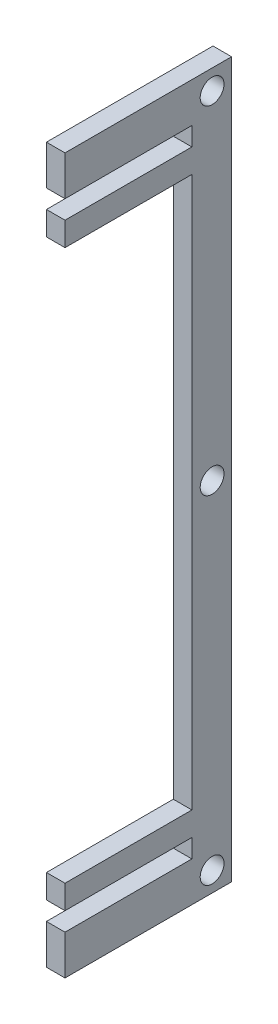
ISO-10303-21;
HEADER;
FILE_DESCRIPTION(('STEP AP214'),'2;1');
FILE_NAME('part.step','',(''),(''),'','','');
FILE_SCHEMA(('AUTOMOTIVE_DESIGN { 1 0 10303 214 1 1 1 1 }'));
ENDSEC;
DATA;
#1=APPLICATION_CONTEXT('core data for automotive mechanical design processes');
#2=APPLICATION_PROTOCOL_DEFINITION('international standard','automotive_design',2000,#1);
#3=PRODUCT_CONTEXT('',#1,'mechanical');
#4=PRODUCT('Part','Part','',(#3));
#5=PRODUCT_RELATED_PRODUCT_CATEGORY('part','',(#4));
#6=PRODUCT_DEFINITION_FORMATION('','',#4);
#7=PRODUCT_DEFINITION_CONTEXT('part definition',#1,'design');
#8=PRODUCT_DEFINITION('design','',#6,#7);
#9=PRODUCT_DEFINITION_SHAPE('','',#8);
#10=(LENGTH_UNIT() NAMED_UNIT(*) SI_UNIT(.MILLI.,.METRE.));
#11=(NAMED_UNIT(*) PLANE_ANGLE_UNIT() SI_UNIT($,.RADIAN.));
#12=(NAMED_UNIT(*) SI_UNIT($,.STERADIAN.) SOLID_ANGLE_UNIT());
#13=UNCERTAINTY_MEASURE_WITH_UNIT(LENGTH_MEASURE(1.E-05),#10,'distance_accuracy_value','');
#14=(GEOMETRIC_REPRESENTATION_CONTEXT(3) GLOBAL_UNCERTAINTY_ASSIGNED_CONTEXT((#13)) GLOBAL_UNIT_ASSIGNED_CONTEXT((#10,
#11,#12)) REPRESENTATION_CONTEXT('',''));
#15=CARTESIAN_POINT('',(0.,0.,0.));
#16=DIRECTION('',(0.,0.,1.));
#17=DIRECTION('',(1.,0.,0.));
#18=AXIS2_PLACEMENT_3D('',#15,#16,#17);
#19=CARTESIAN_POINT('',(2.9718,57.15,13.3216783216783));
#20=DIRECTION('',(0.,0.,-1.));
#21=DIRECTION('',(0.,1.,0.));
#22=AXIS2_PLACEMENT_3D('',#19,#20,#21);
#23=PLANE('',#22);
#24=DIRECTION('',(0.,-1.,0.));
#25=VECTOR('',#24,1.);
#26=CARTESIAN_POINT('',(2.9718,57.15,13.3216783216783));
#27=LINE('',#26,#25);
#28=CARTESIAN_POINT('',(2.9718,-50.8,13.3216783216783));
#29=VERTEX_POINT('',#28);
#30=CARTESIAN_POINT('',(2.9718,-57.15,13.3216783216783));
#31=VERTEX_POINT('',#30);
#32=EDGE_CURVE('E225',#29,#31,#27,.T.);
#33=ORIENTED_EDGE('',*,*,#32,.F.);
#34=DIRECTION('',(1.,0.,0.));
#35=VECTOR('',#34,1.);
#36=CARTESIAN_POINT('',(-0.2032,-50.8,13.3216783216783));
#37=LINE('',#36,#35);
#38=CARTESIAN_POINT('',(0.,-50.8,13.3216783216783));
#39=VERTEX_POINT('',#38);
#40=EDGE_CURVE('E169',#39,#29,#37,.T.);
#41=ORIENTED_EDGE('',*,*,#40,.F.);
#42=DIRECTION('',(0.,-1.,0.));
#43=VECTOR('',#42,1.);
#44=CARTESIAN_POINT('',(0.,57.15,13.3216783216783));
#45=LINE('',#44,#43);
#46=CARTESIAN_POINT('',(0.,-57.15,13.3216783216783));
#47=VERTEX_POINT('',#46);
#48=EDGE_CURVE('E237',#39,#47,#45,.T.);
#49=ORIENTED_EDGE('',*,*,#48,.T.);
#50=DIRECTION('',(-1.,0.,0.));
#51=VECTOR('',#50,1.);
#52=CARTESIAN_POINT('',(2.9718,-57.15,13.3216783216783));
#53=LINE('',#52,#51);
#54=EDGE_CURVE('E229',#31,#47,#53,.T.);
#55=ORIENTED_EDGE('',*,*,#54,.F.);
#56=EDGE_LOOP('',(#33,#41,#49,#55));
#57=FACE_BOUND('',#56,.T.);
#58=ADVANCED_FACE('F41',(#57),#23,.F.);
#59=CARTESIAN_POINT('',(0.,57.15,13.3216783216783));
#60=VERTEX_POINT('',#59);
#61=CARTESIAN_POINT('',(0.,50.8,13.3216783216783));
#62=VERTEX_POINT('',#61);
#63=EDGE_CURVE('E221',#60,#62,#45,.T.);
#64=ORIENTED_EDGE('',*,*,#63,.T.);
#65=DIRECTION('',(1.,0.,0.));
#66=VECTOR('',#65,1.);
#67=CARTESIAN_POINT('',(-0.2032,50.8,13.3216783216783));
#68=LINE('',#67,#66);
#69=CARTESIAN_POINT('',(2.9718,50.8,13.3216783216783));
#70=VERTEX_POINT('',#69);
#71=EDGE_CURVE('E186',#62,#70,#68,.T.);
#72=ORIENTED_EDGE('',*,*,#71,.T.);
#73=CARTESIAN_POINT('',(2.9718,57.15,13.3216783216783));
#74=VERTEX_POINT('',#73);
#75=EDGE_CURVE('E226',#74,#70,#27,.T.);
#76=ORIENTED_EDGE('',*,*,#75,.F.);
#77=DIRECTION('',(-1.,0.,0.));
#78=VECTOR('',#77,1.);
#79=CARTESIAN_POINT('',(2.9718,57.15,13.3216783216783));
#80=LINE('',#79,#78);
#81=EDGE_CURVE('E243',#74,#60,#80,.T.);
#82=ORIENTED_EDGE('',*,*,#81,.T.);
#83=EDGE_LOOP('',(#64,#72,#76,#82));
#84=FACE_BOUND('',#83,.T.);
#85=ADVANCED_FACE('F299',(#84),#23,.F.);
#86=CARTESIAN_POINT('',(0.,-44.0182,13.3216783216783));
#87=VERTEX_POINT('',#86);
#88=CARTESIAN_POINT('',(0.,-47.8282,13.3216783216783));
#89=VERTEX_POINT('',#88);
#90=EDGE_CURVE('E332',#87,#89,#45,.T.);
#91=ORIENTED_EDGE('',*,*,#90,.T.);
#92=DIRECTION('',(1.,0.,0.));
#93=VECTOR('',#92,1.);
#94=CARTESIAN_POINT('',(-0.2032,-47.8282,13.3216783216783));
#95=LINE('',#94,#93);
#96=CARTESIAN_POINT('',(2.9718,-47.8282,13.3216783216783));
#97=VERTEX_POINT('',#96);
#98=EDGE_CURVE('E182',#89,#97,#95,.T.);
#99=ORIENTED_EDGE('',*,*,#98,.T.);
#100=CARTESIAN_POINT('',(2.9718,-44.0182,13.3216783216783));
#101=VERTEX_POINT('',#100);
#102=EDGE_CURVE('E346',#101,#97,#27,.T.);
#103=ORIENTED_EDGE('',*,*,#102,.F.);
#104=DIRECTION('',(1.,0.,0.));
#105=VECTOR('',#104,1.);
#106=CARTESIAN_POINT('',(-0.2032,-44.0182,13.3216783216783));
#107=LINE('',#106,#105);
#108=EDGE_CURVE('E209',#87,#101,#107,.T.);
#109=ORIENTED_EDGE('',*,*,#108,.F.);
#110=EDGE_LOOP('',(#91,#99,#103,#109));
#111=FACE_BOUND('',#110,.T.);
#112=ADVANCED_FACE('F307',(#111),#23,.F.);
#113=CARTESIAN_POINT('',(2.9718,-57.15,-13.3216783216783));
#114=DIRECTION('',(0.,1.,0.));
#115=DIRECTION('',(0.,0.,1.));
#116=AXIS2_PLACEMENT_3D('',#113,#114,#115);
#117=PLANE('',#116);
#118=DIRECTION('',(0.,0.,-1.));
#119=VECTOR('',#118,1.);
#120=CARTESIAN_POINT('',(0.,-57.15,-13.3216783216783));
#121=LINE('',#120,#119);
#122=CARTESIAN_POINT('',(0.,-57.15,-13.3216783216783));
#123=VERTEX_POINT('',#122);
#124=EDGE_CURVE('E181',#47,#123,#121,.T.);
#125=ORIENTED_EDGE('',*,*,#124,.T.);
#126=DIRECTION('',(-1.,0.,0.));
#127=VECTOR('',#126,1.);
#128=CARTESIAN_POINT('',(2.9718,-57.15,-13.3216783216783));
#129=LINE('',#128,#127);
#130=CARTESIAN_POINT('',(2.9718,-57.15,-13.3216783216783));
#131=VERTEX_POINT('',#130);
#132=EDGE_CURVE('E249',#131,#123,#129,.T.);
#133=ORIENTED_EDGE('',*,*,#132,.F.);
#134=DIRECTION('',(0.,0.,-1.));
#135=VECTOR('',#134,1.);
#136=CARTESIAN_POINT('',(2.9718,-57.15,-13.3216783216783));
#137=LINE('',#136,#135);
#138=EDGE_CURVE('E217',#31,#131,#137,.T.);
#139=ORIENTED_EDGE('',*,*,#138,.F.);
#140=ORIENTED_EDGE('',*,*,#54,.T.);
#141=EDGE_LOOP('',(#125,#133,#139,#140));
#142=FACE_BOUND('',#141,.T.);
#143=ADVANCED_FACE('F43',(#142),#117,.F.);
#144=CARTESIAN_POINT('',(2.9718,57.15,-13.3216783216783));
#145=DIRECTION('',(0.,0.,1.));
#146=DIRECTION('',(0.,-1.,0.));
#147=AXIS2_PLACEMENT_3D('',#144,#145,#146);
#148=PLANE('',#147);
#149=DIRECTION('',(0.,1.,0.));
#150=VECTOR('',#149,1.);
#151=CARTESIAN_POINT('',(0.,57.15,-13.3216783216783));
#152=LINE('',#151,#150);
#153=CARTESIAN_POINT('',(0.,57.15,-13.3216783216783));
#154=VERTEX_POINT('',#153);
#155=EDGE_CURVE('E233',#123,#154,#152,.T.);
#156=ORIENTED_EDGE('',*,*,#155,.T.);
#157=DIRECTION('',(-1.,0.,0.));
#158=VECTOR('',#157,1.);
#159=CARTESIAN_POINT('',(2.9718,57.15,-13.3216783216783));
#160=LINE('',#159,#158);
#161=CARTESIAN_POINT('',(2.9718,57.15,-13.3216783216783));
#162=VERTEX_POINT('',#161);
#163=EDGE_CURVE('E246',#162,#154,#160,.T.);
#164=ORIENTED_EDGE('',*,*,#163,.F.);
#165=DIRECTION('',(0.,1.,0.));
#166=VECTOR('',#165,1.);
#167=CARTESIAN_POINT('',(2.9718,57.15,-13.3216783216783));
#168=LINE('',#167,#166);
#169=EDGE_CURVE('E220',#131,#162,#168,.T.);
#170=ORIENTED_EDGE('',*,*,#169,.F.);
#171=ORIENTED_EDGE('',*,*,#132,.T.);
#172=EDGE_LOOP('',(#156,#164,#170,#171));
#173=FACE_BOUND('',#172,.T.);
#174=ADVANCED_FACE('F321',(#173),#148,.F.);
#175=CARTESIAN_POINT('',(2.9718,57.15,-13.3216783216783));
#176=DIRECTION('',(0.,-1.,0.));
#177=DIRECTION('',(0.,0.,-1.));
#178=AXIS2_PLACEMENT_3D('',#175,#176,#177);
#179=PLANE('',#178);
#180=DIRECTION('',(0.,0.,1.));
#181=VECTOR('',#180,1.);
#182=CARTESIAN_POINT('',(0.,57.15,-13.3216783216783));
#183=LINE('',#182,#181);
#184=EDGE_CURVE('E235',#154,#60,#183,.T.);
#185=ORIENTED_EDGE('',*,*,#184,.T.);
#186=ORIENTED_EDGE('',*,*,#81,.F.);
#187=DIRECTION('',(0.,0.,1.));
#188=VECTOR('',#187,1.);
#189=CARTESIAN_POINT('',(2.9718,57.15,-13.3216783216783));
#190=LINE('',#189,#188);
#191=EDGE_CURVE('E223',#162,#74,#190,.T.);
#192=ORIENTED_EDGE('',*,*,#191,.F.);
#193=ORIENTED_EDGE('',*,*,#163,.T.);
#194=EDGE_LOOP('',(#185,#186,#192,#193));
#195=FACE_BOUND('',#194,.T.);
#196=ADVANCED_FACE('F312',(#195),#179,.F.);
#197=CARTESIAN_POINT('',(2.9718,47.8282,13.3216783216783));
#198=VERTEX_POINT('',#197);
#199=CARTESIAN_POINT('',(2.9718,44.0182,13.3216783216783));
#200=VERTEX_POINT('',#199);
#201=EDGE_CURVE('E230',#198,#200,#27,.T.);
#202=ORIENTED_EDGE('',*,*,#201,.F.);
#203=DIRECTION('',(1.,0.,0.));
#204=VECTOR('',#203,1.);
#205=CARTESIAN_POINT('',(-0.2032,47.8282,13.3216783216783));
#206=LINE('',#205,#204);
#207=CARTESIAN_POINT('',(0.,47.8282,13.3216783216783));
#208=VERTEX_POINT('',#207);
#209=EDGE_CURVE('E190',#208,#198,#206,.T.);
#210=ORIENTED_EDGE('',*,*,#209,.F.);
#211=CARTESIAN_POINT('',(0.,44.0182,13.3216783216783));
#212=VERTEX_POINT('',#211);
#213=EDGE_CURVE('E240',#208,#212,#45,.T.);
#214=ORIENTED_EDGE('',*,*,#213,.T.);
#215=DIRECTION('',(1.,0.,0.));
#216=VECTOR('',#215,1.);
#217=CARTESIAN_POINT('',(-0.2032,44.0182,13.3216783216783));
#218=LINE('',#217,#216);
#219=EDGE_CURVE('E206',#212,#200,#218,.T.);
#220=ORIENTED_EDGE('',*,*,#219,.T.);
#221=EDGE_LOOP('',(#202,#210,#214,#220));
#222=FACE_BOUND('',#221,.T.);
#223=ADVANCED_FACE('F302',(#222),#23,.F.);
#224=CARTESIAN_POINT('',(2.9718,0.,0.));
#225=DIRECTION('',(1.,0.,0.));
#226=DIRECTION('',(0.,0.,-1.));
#227=AXIS2_PLACEMENT_3D('',#224,#225,#226);
#228=PLANE('',#227);
#229=CARTESIAN_POINT('',(2.9718,53.975,-10.2092660229042));
#230=DIRECTION('',(1.,0.,0.));
#231=DIRECTION('',(0.,0.,-1.));
#232=AXIS2_PLACEMENT_3D('',#229,#230,#231);
#233=CIRCLE('',#232,1.905);
#234=CARTESIAN_POINT('',(2.9718,53.975,-12.1142660229042));
#235=VERTEX_POINT('',#234);
#236=EDGE_CURVE('E416',#235,#235,#233,.T.);
#237=ORIENTED_EDGE('',*,*,#236,.F.);
#238=EDGE_LOOP('',(#237));
#239=FACE_BOUND('',#238,.T.);
#240=CARTESIAN_POINT('',(2.9718,-53.975,-10.2092660229042));
#241=DIRECTION('',(1.,0.,0.));
#242=DIRECTION('',(0.,0.,-1.));
#243=AXIS2_PLACEMENT_3D('',#240,#241,#242);
#244=CIRCLE('',#243,1.905);
#245=CARTESIAN_POINT('',(2.9718,-53.975,-12.1142660229042));
#246=VERTEX_POINT('',#245);
#247=EDGE_CURVE('E414',#246,#246,#244,.T.);
#248=ORIENTED_EDGE('',*,*,#247,.F.);
#249=EDGE_LOOP('',(#248));
#250=FACE_BOUND('',#249,.T.);
#251=CARTESIAN_POINT('',(2.9718,0.,-10.2092660229042));
#252=DIRECTION('',(1.,0.,0.));
#253=DIRECTION('',(0.,0.,-1.));
#254=AXIS2_PLACEMENT_3D('',#251,#252,#253);
#255=CIRCLE('',#254,1.905);
#256=CARTESIAN_POINT('',(2.9718,0.,-12.1142660229042));
#257=VERTEX_POINT('',#256);
#258=EDGE_CURVE('E276',#257,#257,#255,.T.);
#259=ORIENTED_EDGE('',*,*,#258,.F.);
#260=EDGE_LOOP('',(#259));
#261=FACE_BOUND('',#260,.T.);
#262=DIRECTION('',(0.,0.,-1.));
#263=VECTOR('',#262,1.);
#264=CARTESIAN_POINT('',(2.9718,-50.8,13.3216783216783));
#265=LINE('',#264,#263);
#266=CARTESIAN_POINT('',(2.9718,-50.8,-6.97167832167833));
#267=VERTEX_POINT('',#266);
#268=EDGE_CURVE('E166',#29,#267,#265,.T.);
#269=ORIENTED_EDGE('',*,*,#268,.F.);
#270=ORIENTED_EDGE('',*,*,#32,.T.);
#271=ORIENTED_EDGE('',*,*,#138,.T.);
#272=ORIENTED_EDGE('',*,*,#169,.T.);
#273=ORIENTED_EDGE('',*,*,#191,.T.);
#274=ORIENTED_EDGE('',*,*,#75,.T.);
#275=DIRECTION('',(0.,0.,1.));
#276=VECTOR('',#275,1.);
#277=CARTESIAN_POINT('',(2.9718,50.8,13.3216783216783));
#278=LINE('',#277,#276);
#279=CARTESIAN_POINT('',(2.9718,50.8,-6.97167832167833));
#280=VERTEX_POINT('',#279);
#281=EDGE_CURVE('E172',#280,#70,#278,.T.);
#282=ORIENTED_EDGE('',*,*,#281,.F.);
#283=DIRECTION('',(0.,1.,0.));
#284=VECTOR('',#283,1.);
#285=CARTESIAN_POINT('',(2.9718,50.8,-6.97167832167833));
#286=LINE('',#285,#284);
#287=CARTESIAN_POINT('',(2.9718,47.8282,-6.97167832167833));
#288=VERTEX_POINT('',#287);
#289=EDGE_CURVE('E189',#288,#280,#286,.T.);
#290=ORIENTED_EDGE('',*,*,#289,.F.);
#291=DIRECTION('',(0.,0.,-1.));
#292=VECTOR('',#291,1.);
#293=CARTESIAN_POINT('',(2.9718,47.8282,13.3216783216783));
#294=LINE('',#293,#292);
#295=EDGE_CURVE('E198',#198,#288,#294,.T.);
#296=ORIENTED_EDGE('',*,*,#295,.F.);
#297=ORIENTED_EDGE('',*,*,#201,.T.);
#298=DIRECTION('',(0.,0.,1.));
#299=VECTOR('',#298,1.);
#300=CARTESIAN_POINT('',(2.9718,44.0182,13.3216783216783));
#301=LINE('',#300,#299);
#302=CARTESIAN_POINT('',(2.9718,44.0182,-6.97167832167833));
#303=VERTEX_POINT('',#302);
#304=EDGE_CURVE('E203',#303,#200,#301,.T.);
#305=ORIENTED_EDGE('',*,*,#304,.F.);
#306=DIRECTION('',(0.,1.,0.));
#307=VECTOR('',#306,1.);
#308=CARTESIAN_POINT('',(2.9718,-44.0182,-6.97167832167833));
#309=LINE('',#308,#307);
#310=CARTESIAN_POINT('',(2.9718,-44.0182,-6.97167832167833));
#311=VERTEX_POINT('',#310);
#312=EDGE_CURVE('E212',#311,#303,#309,.T.);
#313=ORIENTED_EDGE('',*,*,#312,.F.);
#314=DIRECTION('',(0.,0.,-1.));
#315=VECTOR('',#314,1.);
#316=CARTESIAN_POINT('',(2.9718,-44.0182,13.3216783216783));
#317=LINE('',#316,#315);
#318=EDGE_CURVE('E195',#101,#311,#317,.T.);
#319=ORIENTED_EDGE('',*,*,#318,.F.);
#320=ORIENTED_EDGE('',*,*,#102,.T.);
#321=DIRECTION('',(0.,0.,1.));
#322=VECTOR('',#321,1.);
#323=CARTESIAN_POINT('',(2.9718,-47.8282,13.3216783216783));
#324=LINE('',#323,#322);
#325=CARTESIAN_POINT('',(2.9718,-47.8282,-6.97167832167833));
#326=VERTEX_POINT('',#325);
#327=EDGE_CURVE('E163',#326,#97,#324,.T.);
#328=ORIENTED_EDGE('',*,*,#327,.F.);
#329=DIRECTION('',(0.,1.,0.));
#330=VECTOR('',#329,1.);
#331=CARTESIAN_POINT('',(2.9718,-50.8,-6.97167832167833));
#332=LINE('',#331,#330);
#333=EDGE_CURVE('E158',#267,#326,#332,.T.);
#334=ORIENTED_EDGE('',*,*,#333,.F.);
#335=EDGE_LOOP('',(#269,#270,#271,#272,#273,#274,#282,#290,#296,#297,#305,#313,#319,#320,#328,#334));
#336=FACE_BOUND('',#335,.T.);
#337=ADVANCED_FACE('F174',(#239,#250,#261,#336),#228,.T.);
#338=CARTESIAN_POINT('',(0.,0.,0.));
#339=DIRECTION('',(1.,0.,0.));
#340=DIRECTION('',(0.,0.,-1.));
#341=AXIS2_PLACEMENT_3D('',#338,#339,#340);
#342=PLANE('',#341);
#343=CARTESIAN_POINT('',(0.,53.975,-10.2092660229042));
#344=DIRECTION('',(1.,0.,0.));
#345=DIRECTION('',(0.,0.,-1.));
#346=AXIS2_PLACEMENT_3D('',#343,#344,#345);
#347=CIRCLE('',#346,1.905);
#348=CARTESIAN_POINT('',(0.,53.975,-12.1142660229042));
#349=VERTEX_POINT('',#348);
#350=EDGE_CURVE('E45',#349,#349,#347,.T.);
#351=ORIENTED_EDGE('',*,*,#350,.T.);
#352=EDGE_LOOP('',(#351));
#353=FACE_BOUND('',#352,.T.);
#354=CARTESIAN_POINT('',(0.,-53.975,-10.2092660229042));
#355=DIRECTION('',(1.,0.,0.));
#356=DIRECTION('',(0.,0.,-1.));
#357=AXIS2_PLACEMENT_3D('',#354,#355,#356);
#358=CIRCLE('',#357,1.905);
#359=CARTESIAN_POINT('',(0.,-53.975,-12.1142660229042));
#360=VERTEX_POINT('',#359);
#361=EDGE_CURVE('E275',#360,#360,#358,.T.);
#362=ORIENTED_EDGE('',*,*,#361,.T.);
#363=EDGE_LOOP('',(#362));
#364=FACE_BOUND('',#363,.T.);
#365=CARTESIAN_POINT('',(0.,0.,-10.2092660229042));
#366=DIRECTION('',(1.,0.,0.));
#367=DIRECTION('',(0.,0.,-1.));
#368=AXIS2_PLACEMENT_3D('',#365,#366,#367);
#369=CIRCLE('',#368,1.905);
#370=CARTESIAN_POINT('',(0.,0.,-12.1142660229042));
#371=VERTEX_POINT('',#370);
#372=EDGE_CURVE('E273',#371,#371,#369,.T.);
#373=ORIENTED_EDGE('',*,*,#372,.T.);
#374=EDGE_LOOP('',(#373));
#375=FACE_BOUND('',#374,.T.);
#376=ORIENTED_EDGE('',*,*,#48,.F.);
#377=DIRECTION('',(0.,0.,-1.));
#378=VECTOR('',#377,1.);
#379=CARTESIAN_POINT('',(0.,-50.8,0.));
#380=LINE('',#379,#378);
#381=CARTESIAN_POINT('',(0.,-50.8,-6.97167832167833));
#382=VERTEX_POINT('',#381);
#383=EDGE_CURVE('E11',#39,#382,#380,.T.);
#384=ORIENTED_EDGE('',*,*,#383,.T.);
#385=DIRECTION('',(0.,1.,0.));
#386=VECTOR('',#385,1.);
#387=CARTESIAN_POINT('',(0.,0.,-6.97167832167831));
#388=LINE('',#387,#386);
#389=CARTESIAN_POINT('',(0.,-47.8282,-6.97167832167833));
#390=VERTEX_POINT('',#389);
#391=EDGE_CURVE('E161',#382,#390,#388,.T.);
#392=ORIENTED_EDGE('',*,*,#391,.T.);
#393=DIRECTION('',(0.,0.,1.));
#394=VECTOR('',#393,1.);
#395=CARTESIAN_POINT('',(0.,-47.8282,0.));
#396=LINE('',#395,#394);
#397=EDGE_CURVE('E50',#390,#89,#396,.T.);
#398=ORIENTED_EDGE('',*,*,#397,.T.);
#399=ORIENTED_EDGE('',*,*,#90,.F.);
#400=DIRECTION('',(0.,0.,-1.));
#401=VECTOR('',#400,1.);
#402=CARTESIAN_POINT('',(0.,-44.0182,0.));
#403=LINE('',#402,#401);
#404=CARTESIAN_POINT('',(0.,-44.0182,-6.97167832167833));
#405=VERTEX_POINT('',#404);
#406=EDGE_CURVE('E258',#87,#405,#403,.T.);
#407=ORIENTED_EDGE('',*,*,#406,.T.);
#408=DIRECTION('',(0.,1.,0.));
#409=VECTOR('',#408,1.);
#410=CARTESIAN_POINT('',(0.,0.,-6.97167832167833));
#411=LINE('',#410,#409);
#412=CARTESIAN_POINT('',(0.,44.0182,-6.97167832167833));
#413=VERTEX_POINT('',#412);
#414=EDGE_CURVE('E252',#405,#413,#411,.T.);
#415=ORIENTED_EDGE('',*,*,#414,.T.);
#416=DIRECTION('',(0.,0.,1.));
#417=VECTOR('',#416,1.);
#418=CARTESIAN_POINT('',(0.,44.0182,0.));
#419=LINE('',#418,#417);
#420=EDGE_CURVE('E255',#413,#212,#419,.T.);
#421=ORIENTED_EDGE('',*,*,#420,.T.);
#422=ORIENTED_EDGE('',*,*,#213,.F.);
#423=DIRECTION('',(0.,0.,-1.));
#424=VECTOR('',#423,1.);
#425=CARTESIAN_POINT('',(0.,47.8282,0.));
#426=LINE('',#425,#424);
#427=CARTESIAN_POINT('',(0.,47.8282,-6.97167832167833));
#428=VERTEX_POINT('',#427);
#429=EDGE_CURVE('E261',#208,#428,#426,.T.);
#430=ORIENTED_EDGE('',*,*,#429,.T.);
#431=DIRECTION('',(0.,1.,0.));
#432=VECTOR('',#431,1.);
#433=CARTESIAN_POINT('',(0.,0.,-6.97167832167834));
#434=LINE('',#433,#432);
#435=CARTESIAN_POINT('',(0.,50.8,-6.97167832167833));
#436=VERTEX_POINT('',#435);
#437=EDGE_CURVE('E264',#428,#436,#434,.T.);
#438=ORIENTED_EDGE('',*,*,#437,.T.);
#439=DIRECTION('',(0.,0.,1.));
#440=VECTOR('',#439,1.);
#441=CARTESIAN_POINT('',(0.,50.8,0.));
#442=LINE('',#441,#440);
#443=EDGE_CURVE('E267',#436,#62,#442,.T.);
#444=ORIENTED_EDGE('',*,*,#443,.T.);
#445=ORIENTED_EDGE('',*,*,#63,.F.);
#446=ORIENTED_EDGE('',*,*,#184,.F.);
#447=ORIENTED_EDGE('',*,*,#155,.F.);
#448=ORIENTED_EDGE('',*,*,#124,.F.);
#449=EDGE_LOOP('',(#376,#384,#392,#398,#399,#407,#415,#421,#422,#430,#438,#444,#445,#446,#447,#448));
#450=FACE_BOUND('',#449,.T.);
#451=ADVANCED_FACE('F283',(#353,#364,#375,#450),#342,.F.);
#452=CARTESIAN_POINT('',(-0.2032,-44.0182,13.3216783216783));
#453=DIRECTION('',(0.,-1.,0.));
#454=DIRECTION('',(0.,0.,-1.));
#455=AXIS2_PLACEMENT_3D('',#452,#453,#454);
#456=PLANE('',#455);
#457=ORIENTED_EDGE('',*,*,#108,.T.);
#458=ORIENTED_EDGE('',*,*,#318,.T.);
#459=DIRECTION('',(1.,0.,0.));
#460=VECTOR('',#459,1.);
#461=CARTESIAN_POINT('',(-0.2032,-44.0182,-6.97167832167833));
#462=LINE('',#461,#460);
#463=EDGE_CURVE('E201',#405,#311,#462,.T.);
#464=ORIENTED_EDGE('',*,*,#463,.F.);
#465=ORIENTED_EDGE('',*,*,#406,.F.);
#466=EDGE_LOOP('',(#457,#458,#464,#465));
#467=FACE_BOUND('',#466,.T.);
#468=ADVANCED_FACE('F362',(#467),#456,.F.);
#469=CARTESIAN_POINT('',(-0.2032,44.0182,13.3216783216783));
#470=DIRECTION('',(0.,1.,0.));
#471=DIRECTION('',(0.,0.,1.));
#472=AXIS2_PLACEMENT_3D('',#469,#470,#471);
#473=PLANE('',#472);
#474=DIRECTION('',(1.,0.,0.));
#475=VECTOR('',#474,1.);
#476=CARTESIAN_POINT('',(-0.2032,44.0182,-6.97167832167833));
#477=LINE('',#476,#475);
#478=EDGE_CURVE('E204',#413,#303,#477,.T.);
#479=ORIENTED_EDGE('',*,*,#478,.T.);
#480=ORIENTED_EDGE('',*,*,#304,.T.);
#481=ORIENTED_EDGE('',*,*,#219,.F.);
#482=ORIENTED_EDGE('',*,*,#420,.F.);
#483=EDGE_LOOP('',(#479,#480,#481,#482));
#484=FACE_BOUND('',#483,.T.);
#485=ADVANCED_FACE('F357',(#484),#473,.F.);
#486=CARTESIAN_POINT('',(-0.2032,-44.0182,-6.97167832167833));
#487=DIRECTION('',(0.,0.,-1.));
#488=DIRECTION('',(-1.,0.,0.));
#489=AXIS2_PLACEMENT_3D('',#486,#487,#488);
#490=PLANE('',#489);
#491=ORIENTED_EDGE('',*,*,#463,.T.);
#492=ORIENTED_EDGE('',*,*,#312,.T.);
#493=ORIENTED_EDGE('',*,*,#478,.F.);
#494=ORIENTED_EDGE('',*,*,#414,.F.);
#495=EDGE_LOOP('',(#491,#492,#493,#494));
#496=FACE_BOUND('',#495,.T.);
#497=ADVANCED_FACE('F360',(#496),#490,.F.);
#498=CARTESIAN_POINT('',(-0.2032,50.8,13.3216783216783));
#499=DIRECTION('',(0.,1.,0.));
#500=DIRECTION('',(0.,0.,1.));
#501=AXIS2_PLACEMENT_3D('',#498,#499,#500);
#502=PLANE('',#501);
#503=DIRECTION('',(1.,0.,0.));
#504=VECTOR('',#503,1.);
#505=CARTESIAN_POINT('',(-0.2032,50.8,-6.97167832167833));
#506=LINE('',#505,#504);
#507=EDGE_CURVE('E193',#436,#280,#506,.T.);
#508=ORIENTED_EDGE('',*,*,#507,.T.);
#509=ORIENTED_EDGE('',*,*,#281,.T.);
#510=ORIENTED_EDGE('',*,*,#71,.F.);
#511=ORIENTED_EDGE('',*,*,#443,.F.);
#512=EDGE_LOOP('',(#508,#509,#510,#511));
#513=FACE_BOUND('',#512,.T.);
#514=ADVANCED_FACE('F374',(#513),#502,.F.);
#515=CARTESIAN_POINT('',(-0.2032,50.8,-6.97167832167833));
#516=DIRECTION('',(0.,0.,-1.));
#517=DIRECTION('',(0.,1.,0.));
#518=AXIS2_PLACEMENT_3D('',#515,#516,#517);
#519=PLANE('',#518);
#520=DIRECTION('',(1.,0.,0.));
#521=VECTOR('',#520,1.);
#522=CARTESIAN_POINT('',(-0.2032,47.8282,-6.97167832167833));
#523=LINE('',#522,#521);
#524=EDGE_CURVE('E66',#428,#288,#523,.T.);
#525=ORIENTED_EDGE('',*,*,#524,.T.);
#526=ORIENTED_EDGE('',*,*,#289,.T.);
#527=ORIENTED_EDGE('',*,*,#507,.F.);
#528=ORIENTED_EDGE('',*,*,#437,.F.);
#529=EDGE_LOOP('',(#525,#526,#527,#528));
#530=FACE_BOUND('',#529,.T.);
#531=ADVANCED_FACE('F371',(#530),#519,.F.);
#532=CARTESIAN_POINT('',(-0.2032,47.8282,13.3216783216783));
#533=DIRECTION('',(0.,-1.,0.));
#534=DIRECTION('',(0.,0.,-1.));
#535=AXIS2_PLACEMENT_3D('',#532,#533,#534);
#536=PLANE('',#535);
#537=ORIENTED_EDGE('',*,*,#209,.T.);
#538=ORIENTED_EDGE('',*,*,#295,.T.);
#539=ORIENTED_EDGE('',*,*,#524,.F.);
#540=ORIENTED_EDGE('',*,*,#429,.F.);
#541=EDGE_LOOP('',(#537,#538,#539,#540));
#542=FACE_BOUND('',#541,.T.);
#543=ADVANCED_FACE('F383',(#542),#536,.F.);
#544=CARTESIAN_POINT('',(-0.2032,-50.8,13.3216783216783));
#545=DIRECTION('',(0.,-1.,0.));
#546=DIRECTION('',(0.,0.,-1.));
#547=AXIS2_PLACEMENT_3D('',#544,#545,#546);
#548=PLANE('',#547);
#549=ORIENTED_EDGE('',*,*,#40,.T.);
#550=ORIENTED_EDGE('',*,*,#268,.T.);
#551=DIRECTION('',(1.,0.,0.));
#552=VECTOR('',#551,1.);
#553=CARTESIAN_POINT('',(-0.2032,-50.8,-6.97167832167833));
#554=LINE('',#553,#552);
#555=EDGE_CURVE('E154',#382,#267,#554,.T.);
#556=ORIENTED_EDGE('',*,*,#555,.F.);
#557=ORIENTED_EDGE('',*,*,#383,.F.);
#558=EDGE_LOOP('',(#549,#550,#556,#557));
#559=FACE_BOUND('',#558,.T.);
#560=ADVANCED_FACE('F167',(#559),#548,.F.);
#561=CARTESIAN_POINT('',(-0.2032,-47.8282,13.3216783216783));
#562=DIRECTION('',(0.,1.,0.));
#563=DIRECTION('',(0.,0.,1.));
#564=AXIS2_PLACEMENT_3D('',#561,#562,#563);
#565=PLANE('',#564);
#566=DIRECTION('',(1.,0.,0.));
#567=VECTOR('',#566,1.);
#568=CARTESIAN_POINT('',(-0.2032,-47.8282,-6.97167832167833));
#569=LINE('',#568,#567);
#570=EDGE_CURVE('E58',#390,#326,#569,.T.);
#571=ORIENTED_EDGE('',*,*,#570,.T.);
#572=ORIENTED_EDGE('',*,*,#327,.T.);
#573=ORIENTED_EDGE('',*,*,#98,.F.);
#574=ORIENTED_EDGE('',*,*,#397,.F.);
#575=EDGE_LOOP('',(#571,#572,#573,#574));
#576=FACE_BOUND('',#575,.T.);
#577=ADVANCED_FACE('F391',(#576),#565,.F.);
#578=CARTESIAN_POINT('',(-0.2032,-50.8,-6.97167832167833));
#579=DIRECTION('',(0.,0.,-1.));
#580=DIRECTION('',(0.,1.,0.));
#581=AXIS2_PLACEMENT_3D('',#578,#579,#580);
#582=PLANE('',#581);
#583=ORIENTED_EDGE('',*,*,#555,.T.);
#584=ORIENTED_EDGE('',*,*,#333,.T.);
#585=ORIENTED_EDGE('',*,*,#570,.F.);
#586=ORIENTED_EDGE('',*,*,#391,.F.);
#587=EDGE_LOOP('',(#583,#584,#585,#586));
#588=FACE_BOUND('',#587,.T.);
#589=ADVANCED_FACE('F156',(#588),#582,.F.);
#590=CARTESIAN_POINT('',(-0.2032,0.,-10.2092660229042));
#591=DIRECTION('',(1.,0.,0.));
#592=DIRECTION('',(0.,0.,-1.));
#593=AXIS2_PLACEMENT_3D('',#590,#591,#592);
#594=CYLINDRICAL_SURFACE('',#593,1.905);
#595=ORIENTED_EDGE('',*,*,#258,.T.);
#596=EDGE_LOOP('',(#595));
#597=FACE_BOUND('',#596,.T.);
#598=ORIENTED_EDGE('',*,*,#372,.F.);
#599=EDGE_LOOP('',(#598));
#600=FACE_BOUND('',#599,.T.);
#601=ADVANCED_FACE('F293',(#597,#600),#594,.F.);
#602=CARTESIAN_POINT('',(-0.2032,-53.975,-10.2092660229042));
#603=DIRECTION('',(1.,0.,0.));
#604=DIRECTION('',(0.,0.,-1.));
#605=AXIS2_PLACEMENT_3D('',#602,#603,#604);
#606=CYLINDRICAL_SURFACE('',#605,1.905);
#607=ORIENTED_EDGE('',*,*,#247,.T.);
#608=EDGE_LOOP('',(#607));
#609=FACE_BOUND('',#608,.T.);
#610=ORIENTED_EDGE('',*,*,#361,.F.);
#611=EDGE_LOOP('',(#610));
#612=FACE_BOUND('',#611,.T.);
#613=ADVANCED_FACE('F287',(#609,#612),#606,.F.);
#614=CARTESIAN_POINT('',(-0.2032,53.975,-10.2092660229042));
#615=DIRECTION('',(1.,0.,0.));
#616=DIRECTION('',(0.,0.,-1.));
#617=AXIS2_PLACEMENT_3D('',#614,#615,#616);
#618=CYLINDRICAL_SURFACE('',#617,1.905);
#619=ORIENTED_EDGE('',*,*,#236,.T.);
#620=EDGE_LOOP('',(#619));
#621=FACE_BOUND('',#620,.T.);
#622=ORIENTED_EDGE('',*,*,#350,.F.);
#623=EDGE_LOOP('',(#622));
#624=FACE_BOUND('',#623,.T.);
#625=ADVANCED_FACE('F285',(#621,#624),#618,.F.);
#626=CLOSED_SHELL('',(#58,#85,#112,#143,#174,#196,#223,#337,#451,#468,#485,#497,#514,#531,#543,
#560,#577,#589,#601,#613,#625));
#627=MANIFOLD_SOLID_BREP('B2',#626);
#628=ADVANCED_BREP_SHAPE_REPRESENTATION('',(#18,#627),#14);
#629=SHAPE_DEFINITION_REPRESENTATION(#9,#628);
ENDSEC;
END-ISO-10303-21;
